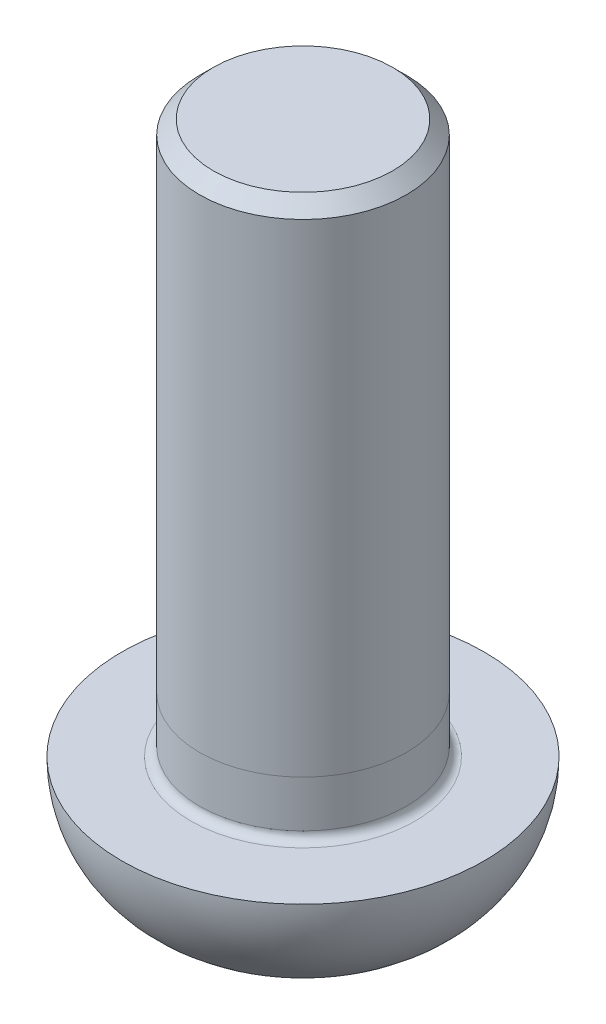
ISO-10303-21;
HEADER;
FILE_DESCRIPTION(('STEP AP214'),'2;1');
FILE_NAME('part.step','',(''),(''),'','','');
FILE_SCHEMA(('AUTOMOTIVE_DESIGN { 1 0 10303 214 1 1 1 1 }'));
ENDSEC;
DATA;
#1=APPLICATION_CONTEXT('core data for automotive mechanical design processes');
#2=APPLICATION_PROTOCOL_DEFINITION('international standard','automotive_design',2000,#1);
#3=PRODUCT_CONTEXT('',#1,'mechanical');
#4=PRODUCT('Part','Part','',(#3));
#5=PRODUCT_RELATED_PRODUCT_CATEGORY('part','',(#4));
#6=PRODUCT_DEFINITION_FORMATION('','',#4);
#7=PRODUCT_DEFINITION_CONTEXT('part definition',#1,'design');
#8=PRODUCT_DEFINITION('design','',#6,#7);
#9=PRODUCT_DEFINITION_SHAPE('','',#8);
#10=(LENGTH_UNIT() NAMED_UNIT(*) SI_UNIT(.MILLI.,.METRE.));
#11=(NAMED_UNIT(*) PLANE_ANGLE_UNIT() SI_UNIT($,.RADIAN.));
#12=(NAMED_UNIT(*) SI_UNIT($,.STERADIAN.) SOLID_ANGLE_UNIT());
#13=UNCERTAINTY_MEASURE_WITH_UNIT(LENGTH_MEASURE(1.E-05),#10,'distance_accuracy_value','');
#14=(GEOMETRIC_REPRESENTATION_CONTEXT(3) GLOBAL_UNCERTAINTY_ASSIGNED_CONTEXT((#13)) GLOBAL_UNIT_ASSIGNED_CONTEXT((#10,
#11,#12)) REPRESENTATION_CONTEXT('',''));
#15=CARTESIAN_POINT('',(0.,0.,0.));
#16=DIRECTION('',(0.,0.,1.));
#17=DIRECTION('',(1.,0.,0.));
#18=AXIS2_PLACEMENT_3D('',#15,#16,#17);
#19=CARTESIAN_POINT('',(0.,0.,0.));
#20=DIRECTION('',(0.,1.,0.));
#21=DIRECTION('',(0.,0.,1.));
#22=AXIS2_PLACEMENT_3D('',#19,#20,#21);
#23=CYLINDRICAL_SURFACE('',#22,3.);
#24=CARTESIAN_POINT('',(0.,15.6,0.));
#25=DIRECTION('',(0.,1.,0.));
#26=DIRECTION('',(0.,0.,1.));
#27=AXIS2_PLACEMENT_3D('',#24,#25,#26);
#28=CIRCLE('',#27,3.);
#29=CARTESIAN_POINT('',(0.,15.6,3.));
#30=VERTEX_POINT('',#29);
#31=EDGE_CURVE('E28',#30,#30,#28,.F.);
#32=ORIENTED_EDGE('',*,*,#31,.T.);
#33=EDGE_LOOP('',(#32));
#34=FACE_BOUND('',#33,.T.);
#35=CARTESIAN_POINT('',(0.,1.6,0.));
#36=DIRECTION('',(0.,1.,0.));
#37=DIRECTION('',(0.,0.,1.));
#38=AXIS2_PLACEMENT_3D('',#35,#36,#37);
#39=CIRCLE('',#38,3.);
#40=CARTESIAN_POINT('',(0.,1.6,3.));
#41=VERTEX_POINT('',#40);
#42=EDGE_CURVE('E11',#41,#41,#39,.T.);
#43=ORIENTED_EDGE('',*,*,#42,.T.);
#44=EDGE_LOOP('',(#43));
#45=FACE_BOUND('',#44,.T.);
#46=ADVANCED_FACE('F18',(#34,#45),#23,.T.);
#47=ORIENTED_EDGE('',*,*,#42,.F.);
#48=EDGE_LOOP('',(#47));
#49=FACE_BOUND('',#48,.T.);
#50=CARTESIAN_POINT('',(0.,0.25,0.));
#51=DIRECTION('',(0.,1.,0.));
#52=DIRECTION('',(0.,0.,1.));
#53=AXIS2_PLACEMENT_3D('',#50,#51,#52);
#54=CIRCLE('',#53,3.);
#55=CARTESIAN_POINT('',(0.,0.25,3.));
#56=VERTEX_POINT('',#55);
#57=EDGE_CURVE('E280',#56,#56,#54,.T.);
#58=ORIENTED_EDGE('',*,*,#57,.T.);
#59=EDGE_LOOP('',(#58));
#60=FACE_BOUND('',#59,.T.);
#61=ADVANCED_FACE('F192',(#49,#60),#23,.T.);
#62=CARTESIAN_POINT('',(5.25,0.,0.));
#63=DIRECTION('',(0.,1.,0.));
#64=DIRECTION('',(0.,0.,1.));
#65=AXIS2_PLACEMENT_3D('',#62,#63,#64);
#66=PLANE('',#65);
#67=CARTESIAN_POINT('',(0.,0.,0.));
#68=DIRECTION('',(0.,1.,0.));
#69=DIRECTION('',(0.,0.,1.));
#70=AXIS2_PLACEMENT_3D('',#67,#68,#69);
#71=CIRCLE('',#70,3.25);
#72=CARTESIAN_POINT('',(0.,0.,3.25));
#73=VERTEX_POINT('',#72);
#74=EDGE_CURVE('E277',#73,#73,#71,.F.);
#75=ORIENTED_EDGE('',*,*,#74,.T.);
#76=EDGE_LOOP('',(#75));
#77=FACE_BOUND('',#76,.T.);
#78=CARTESIAN_POINT('',(0.,0.,0.));
#79=DIRECTION('',(0.,1.,0.));
#80=DIRECTION('',(0.,0.,1.));
#81=AXIS2_PLACEMENT_3D('',#78,#79,#80);
#82=CIRCLE('',#81,5.25);
#83=CARTESIAN_POINT('',(0.,0.,5.25));
#84=VERTEX_POINT('',#83);
#85=EDGE_CURVE('E108',#84,#84,#82,.T.);
#86=ORIENTED_EDGE('',*,*,#85,.T.);
#87=EDGE_LOOP('',(#86));
#88=FACE_BOUND('',#87,.T.);
#89=ADVANCED_FACE('F199',(#77,#88),#66,.T.);
#90=CARTESIAN_POINT('',(0.,16.,0.));
#91=DIRECTION('',(0.,1.,0.));
#92=DIRECTION('',(0.,0.,1.));
#93=AXIS2_PLACEMENT_3D('',#90,#91,#92);
#94=PLANE('',#93);
#95=CARTESIAN_POINT('',(0.,16.,0.));
#96=DIRECTION('',(0.,1.,0.));
#97=DIRECTION('',(0.,0.,1.));
#98=AXIS2_PLACEMENT_3D('',#95,#96,#97);
#99=CIRCLE('',#98,2.6);
#100=CARTESIAN_POINT('',(0.,16.,2.6));
#101=VERTEX_POINT('',#100);
#102=EDGE_CURVE('E282',#101,#101,#99,.T.);
#103=ORIENTED_EDGE('',*,*,#102,.T.);
#104=EDGE_LOOP('',(#103));
#105=FACE_BOUND('',#104,.T.);
#106=ADVANCED_FACE('F227',(#105),#94,.T.);
#107=CARTESIAN_POINT('',(0.,0.25,0.));
#108=DIRECTION('',(0.,1.,0.));
#109=DIRECTION('',(0.,0.,1.));
#110=AXIS2_PLACEMENT_3D('',#107,#108,#109);
#111=TOROIDAL_SURFACE('',#110,3.25,0.25);
#112=ORIENTED_EDGE('',*,*,#74,.F.);
#113=EDGE_LOOP('',(#112));
#114=FACE_BOUND('',#113,.T.);
#115=ORIENTED_EDGE('',*,*,#57,.F.);
#116=EDGE_LOOP('',(#115));
#117=FACE_BOUND('',#116,.T.);
#118=ADVANCED_FACE('F265',(#114,#117),#111,.F.);
#119=CARTESIAN_POINT('',(0.,16.,0.));
#120=DIRECTION('',(0.,-1.,0.));
#121=DIRECTION('',(0.,0.,-1.));
#122=AXIS2_PLACEMENT_3D('',#119,#120,#121);
#123=CONICAL_SURFACE('',#122,2.6,0.785398163397449);
#124=ORIENTED_EDGE('',*,*,#31,.F.);
#125=EDGE_LOOP('',(#124));
#126=FACE_BOUND('',#125,.T.);
#127=ORIENTED_EDGE('',*,*,#102,.F.);
#128=EDGE_LOOP('',(#127));
#129=FACE_BOUND('',#128,.T.);
#130=ADVANCED_FACE('F21',(#126,#129),#123,.T.);
#131=CARTESIAN_POINT('',(0.,0.,0.));
#132=DIRECTION('',(0.,-1.,0.));
#133=DIRECTION('',(0.,0.,-1.));
#134=AXIS2_PLACEMENT_3D('',#131,#132,#133);
#135=DEGENERATE_TOROIDAL_SURFACE('',#134,1.67165208586472,3.57834791413527,.T.);
#136=ORIENTED_EDGE('',*,*,#85,.F.);
#137=EDGE_LOOP('',(#136));
#138=FACE_BOUND('',#137,.T.);
#139=CARTESIAN_POINT('',(0.,-3.3,0.));
#140=DIRECTION('',(0.,-1.,0.));
#141=DIRECTION('',(0.,0.,-1.));
#142=AXIS2_PLACEMENT_3D('',#139,#140,#141);
#143=CIRCLE('',#142,3.05533333333333);
#144=CARTESIAN_POINT('',(0.,-3.3,-3.05533333333333));
#145=VERTEX_POINT('',#144);
#146=EDGE_CURVE('E119',#145,#145,#143,.T.);
#147=ORIENTED_EDGE('',*,*,#146,.F.);
#148=EDGE_LOOP('',(#147));
#149=FACE_BOUND('',#148,.T.);
#150=ADVANCED_FACE('F143',(#138,#149),#135,.T.);
#151=CARTESIAN_POINT('',(0.,0.391673276442843,0.));
#152=DIRECTION('',(0.,-1.,0.));
#153=DIRECTION('',(0.,0.,-1.));
#154=AXIS2_PLACEMENT_3D('',#151,#152,#153);
#155=CONICAL_SURFACE('',#154,0.,1.0471975511966);
#156=CARTESIAN_POINT('',(0.,0.391673276442843,0.));
#157=VERTEX_POINT('',#156);
#158=VERTEX_LOOP('',#157);
#159=FACE_BOUND('',#158,.T.);
#160=CARTESIAN_POINT('',(-1.15458506832542,-0.94172672855691,2.0002));
#161=CARTESIAN_POINT('',(-1.20532911262018,-0.91241679803709,1.91230873709994));
#162=CARTESIAN_POINT('',(-1.2565111744778,-0.885760113916877,1.82365880552641));
#163=CARTESIAN_POINT('',(-1.3597616401932,-0.839229752957131,1.6448237530022));
#164=CARTESIAN_POINT('',(-1.41183187919145,-0.81937253831919,1.55463545349496));
#165=CARTESIAN_POINT('',(-1.51532701829184,-0.788460725959663,1.37537661423669));
#166=CARTESIAN_POINT('',(-1.56673599086579,-0.777200413534941,1.28633366177369));
#167=CARTESIAN_POINT('',(-1.66979593505374,-0.763755924531052,1.10782860221495));
#168=CARTESIAN_POINT('',(-1.72144653186531,-0.76156061688988,1.01836714429604));
#169=CARTESIAN_POINT('',(-1.81796535054794,-0.766118251267061,0.851191646451196));
#170=CARTESIAN_POINT('',(-1.86284799277603,-0.771752136623426,0.773452629734213));
#171=CARTESIAN_POINT('',(-1.95232085557725,-0.789611157197239,0.618481085463865));
#172=CARTESIAN_POINT('',(-1.99691076648955,-0.80184239795985,0.5412490942588));
#173=CARTESIAN_POINT('',(-2.08656822922817,-0.83242069880402,0.385957813517798));
#174=CARTESIAN_POINT('',(-2.13162442866767,-0.850897429002127,0.30791818689262));
#175=CARTESIAN_POINT('',(-2.221064675979,-0.892832780149267,0.153003134307866));
#176=CARTESIAN_POINT('',(-2.26544987045196,-0.916281542428724,0.0761257223768805));
#177=CARTESIAN_POINT('',(-2.30951654681234,-0.941726728556909,-0.000200000000000286));
#178=B_SPLINE_CURVE_WITH_KNOTS('',3,(#160,#161,#162,#163,#164,#165,#166,#167,#168,#169,#170,
#171,#172,#173,#174,#175,#176,#177),.UNSPECIFIED.,.F.,.F.,(4,2,2,2,2,2,2,2,4),(0.,
0.317031824695611,0.634825876346566,0.944753967652639,1.25430138000372,1.52387047293094,
1.79368946861028,2.06949491027634,2.34475850821472),.UNSPECIFIED.);
#179=CARTESIAN_POINT('',(-1.15470053837926,-0.941660056890495,2.));
#180=VERTEX_POINT('',#179);
#181=CARTESIAN_POINT('',(-2.3094010767585,-0.941660056890495,0.));
#182=VERTEX_POINT('',#181);
#183=EDGE_CURVE('E231',#180,#182,#178,.T.);
#184=ORIENTED_EDGE('',*,*,#183,.T.);
#185=CARTESIAN_POINT('',(-2.30951654681234,-0.941726728556909,0.000200000000000068));
#186=CARTESIAN_POINT('',(-2.25877250251757,-0.912416798037087,-0.0876912629000592));
#187=CARTESIAN_POINT('',(-2.20759044065995,-0.885760113916874,-0.17634119447359));
#188=CARTESIAN_POINT('',(-2.10433997494456,-0.839229752957128,-0.355176246997801));
#189=CARTESIAN_POINT('',(-2.0522697359463,-0.819372538319187,-0.445364546505036));
#190=CARTESIAN_POINT('',(-1.94877459684592,-0.78846072595966,-0.624623385763305));
#191=CARTESIAN_POINT('',(-1.89736562427197,-0.777200413534938,-0.713666338226303));
#192=CARTESIAN_POINT('',(-1.79430568008402,-0.76375592453105,-0.892171397785043));
#193=CARTESIAN_POINT('',(-1.74265508327244,-0.761560616889878,-0.981632855703958));
#194=CARTESIAN_POINT('',(-1.64613626458981,-0.766118251267059,-1.1488083535488));
#195=CARTESIAN_POINT('',(-1.60125362236172,-0.771752136623423,-1.22654737026578));
#196=CARTESIAN_POINT('',(-1.5117807595605,-0.789611157197236,-1.38151891453613));
#197=CARTESIAN_POINT('',(-1.46719084864821,-0.801842397959847,-1.4587509057412));
#198=CARTESIAN_POINT('',(-1.37753338590959,-0.832420698804018,-1.6140421864822));
#199=CARTESIAN_POINT('',(-1.33247718647008,-0.850897429002124,-1.69208181310738));
#200=CARTESIAN_POINT('',(-1.24303693915875,-0.892832780149265,-1.84699686569214));
#201=CARTESIAN_POINT('',(-1.19865174468579,-0.916281542428723,-1.92387427762312));
#202=CARTESIAN_POINT('',(-1.15458506832541,-0.94172672855691,-2.0002));
#203=B_SPLINE_CURVE_WITH_KNOTS('',3,(#185,#186,#187,#188,#189,#190,#191,#192,#193,#194,#195,
#196,#197,#198,#199,#200,#201,#202),.UNSPECIFIED.,.F.,.F.,(4,2,2,2,2,2,2,2,4),(0.,
0.317031824695611,0.634825876346565,0.944753967652637,1.25430138000371,1.52387047293094,
1.79368946861029,2.06949491027634,2.34475850821473),.UNSPECIFIED.);
#204=CARTESIAN_POINT('',(-1.15470053837925,-0.941660056890493,-2.));
#205=VERTEX_POINT('',#204);
#206=EDGE_CURVE('E210',#182,#205,#203,.T.);
#207=ORIENTED_EDGE('',*,*,#206,.T.);
#208=CARTESIAN_POINT('',(-3.97107242292986,-2.17538835040825,-2.));
#209=CARTESIAN_POINT('',(-3.87868247277526,-2.12775059746127,-2.));
#210=CARTESIAN_POINT('',(-3.7861588003778,-2.08037372958414,-2.));
#211=CARTESIAN_POINT('',(-3.60078450821548,-1.98626017948102,-2.00000000000001));
#212=CARTESIAN_POINT('',(-3.50793388259158,-1.93952350880157,-2.00000000000001));
#213=CARTESIAN_POINT('',(-3.22850900761148,-1.80030535880982,-2.));
#214=CARTESIAN_POINT('',(-3.04135761037277,-1.70896924768975,-2.));
#215=CARTESIAN_POINT('',(-2.75397555619272,-1.5731154540905,-2.));
#216=CARTESIAN_POINT('',(-2.65454530475032,-1.52690595800733,-2.));
#217=CARTESIAN_POINT('',(-2.45492785759602,-1.43615536855376,-2.));
#218=CARTESIAN_POINT('',(-2.3547406899451,-1.39161421369455,-2.));
#219=CARTESIAN_POINT('',(-2.15350213975009,-1.30470652650298,-2.));
#220=CARTESIAN_POINT('',(-2.05245137959688,-1.26233856057289,-2.));
#221=CARTESIAN_POINT('',(-1.84919030086332,-1.18039650371769,-2.));
#222=CARTESIAN_POINT('',(-1.74697972173689,-1.14082305558609,-2.));
#223=CARTESIAN_POINT('',(-1.52508206994959,-1.05946514421621,-2.));
#224=CARTESIAN_POINT('',(-1.40516322629618,-1.01830385306277,-2.));
#225=CARTESIAN_POINT('',(-1.16321218809007,-0.942832074454553,-2.));
#226=CARTESIAN_POINT('',(-1.04118108489843,-0.908518157540933,-2.));
#227=CARTESIAN_POINT('',(-0.797191699347654,-0.849762632395411,-2.));
#228=CARTESIAN_POINT('',(-0.675277439673617,-0.825143320410585,-2.));
#229=CARTESIAN_POINT('',(-0.42968597996561,-0.78740551194056,-2.));
#230=CARTESIAN_POINT('',(-0.306009864773069,-0.774280224898857,-2.));
#231=CARTESIAN_POINT('',(-0.0561948130021474,-0.761222818220792,-2.));
#232=CARTESIAN_POINT('',(0.0699543957642671,-0.761477523372083,-2.));
#233=CARTESIAN_POINT('',(0.321490472578919,-0.775609005131668,-2.));
#234=CARTESIAN_POINT('',(0.446877078128915,-0.789490231676833,-2.));
#235=CARTESIAN_POINT('',(0.698268076239721,-0.829339251040338,-2.));
#236=CARTESIAN_POINT('',(0.824232704616094,-0.855548309192251,-1.99999999999999));
#237=CARTESIAN_POINT('',(1.07382197335698,-0.917314019236256,-2.));
#238=CARTESIAN_POINT('',(1.19744582529425,-0.952873762658447,-2.));
#239=CARTESIAN_POINT('',(1.43877717975325,-1.02962266424125,-2.));
#240=CARTESIAN_POINT('',(1.55655051066925,-1.07060890554915,-2.));
#241=CARTESIAN_POINT('',(1.79038315988528,-1.15724391469459,-1.99999999999999));
#242=CARTESIAN_POINT('',(1.90644203337208,-1.20289386902531,-1.99999999999999));
#243=CARTESIAN_POINT('',(2.13727613898438,-1.29764227315016,-1.99999999999999));
#244=CARTESIAN_POINT('',(2.25204987258198,-1.3467443434052,-1.99999999999999));
#245=CARTESIAN_POINT('',(2.48048565996255,-1.44747310577301,-1.99999999999999));
#246=CARTESIAN_POINT('',(2.59414765093807,-1.499099939544,-1.99999999999999));
#247=CARTESIAN_POINT('',(2.81406706680889,-1.60122748447267,-1.99999999999999));
#248=CARTESIAN_POINT('',(2.92037405177845,-1.65162191070667,-1.99999999999999));
#249=CARTESIAN_POINT('',(3.1323563665145,-1.75372845058398,-1.99999999999999));
#250=CARTESIAN_POINT('',(3.23803167473215,-1.80544060886685,-1.99999999999999));
#251=CARTESIAN_POINT('',(3.44851064882037,-1.90972549113419,-1.99999999999999));
#252=CARTESIAN_POINT('',(3.55331605390046,-1.96229471304186,-1.99999999999999));
#253=CARTESIAN_POINT('',(3.7624942913087,-2.06826501338616,-1.99999999999999));
#254=CARTESIAN_POINT('',(3.86686716058578,-2.12166601883339,-1.99999999999999));
#255=CARTESIAN_POINT('',(3.97107242292986,-2.17538835040825,-2.));
#256=B_SPLINE_CURVE_WITH_KNOTS('',3,(#208,#209,#210,#211,#212,#213,#214,#215,#216,#217,#218,
#219,#220,#221,#222,#223,#224,#225,#226,#227,#228,#229,#230,#231,#232,#233,#234,#235,#236,#237,
#238,#239,#240,#241,#242,#243,#244,#245,#246,#247,#248,#249,#250,#251,#252,#253,#254,#255),
.UNSPECIFIED.,.F.,.F.,(4,2,2,2,2,2,2,2,2,2,2,2,2,2,2,2,2,2,2,2,2,2,2,4),(0.,0.311842723826934,
0.62369106463389,1.24838758455579,1.57730682351192,1.90621392778465,2.23490119378745,
2.56366381964157,2.94387628317646,3.32389783939494,3.69658721194995,4.06905625447051,
4.44672744508521,4.82452201071132,5.21003920255201,5.59568401496473,5.96965872681082,
6.34372881945369,6.71819725104189,7.09268671728378,7.44561614609446,7.79855754669429,
8.15030525169476,8.50202226264185),.UNSPECIFIED.);
#257=CARTESIAN_POINT('',(1.15470053837925,-0.941660056890495,-2.));
#258=VERTEX_POINT('',#257);
#259=EDGE_CURVE('E106',#205,#258,#256,.T.);
#260=ORIENTED_EDGE('',*,*,#259,.T.);
#261=CARTESIAN_POINT('',(1.15458506832542,-0.941726728556909,-2.0002));
#262=CARTESIAN_POINT('',(1.20532911262018,-0.912416798037089,-1.91230873709994));
#263=CARTESIAN_POINT('',(1.2565111744778,-0.885760113916877,-1.82365880552641));
#264=CARTESIAN_POINT('',(1.3597616401932,-0.839229752957131,-1.6448237530022));
#265=CARTESIAN_POINT('',(1.41183187919145,-0.819372538319189,-1.55463545349496));
#266=CARTESIAN_POINT('',(1.51532701829183,-0.788460725959662,-1.37537661423669));
#267=CARTESIAN_POINT('',(1.56673599086579,-0.77720041353494,-1.2863336617737));
#268=CARTESIAN_POINT('',(1.66979593505373,-0.763755924531052,-1.10782860221496));
#269=CARTESIAN_POINT('',(1.72144653186531,-0.761560616889879,-1.01836714429604));
#270=CARTESIAN_POINT('',(1.81796535054794,-0.76611825126706,-0.851191646451199));
#271=CARTESIAN_POINT('',(1.86284799277603,-0.771752136623425,-0.773452629734215));
#272=CARTESIAN_POINT('',(1.95232085557725,-0.789611157197238,-0.618481085463866));
#273=CARTESIAN_POINT('',(1.99691076648955,-0.801842397959849,-0.5412490942588));
#274=CARTESIAN_POINT('',(2.08656822922816,-0.83242069880402,-0.385957813517798));
#275=CARTESIAN_POINT('',(2.13162442866767,-0.850897429002126,-0.307918186892619));
#276=CARTESIAN_POINT('',(2.221064675979,-0.892832780149266,-0.153003134307863));
#277=CARTESIAN_POINT('',(2.26544987045196,-0.916281542428724,-0.0761257223768775));
#278=CARTESIAN_POINT('',(2.30951654681234,-0.941726728556909,0.000200000000003712));
#279=B_SPLINE_CURVE_WITH_KNOTS('',3,(#261,#262,#263,#264,#265,#266,#267,#268,#269,#270,#271,
#272,#273,#274,#275,#276,#277,#278),.UNSPECIFIED.,.F.,.F.,(4,2,2,2,2,2,2,2,4),(0.,
0.31703182469561,0.634825876346564,0.944753967652636,1.25430138000371,1.52387047293094,
1.79368946861028,2.06949491027634,2.34475850821473),.UNSPECIFIED.);
#280=CARTESIAN_POINT('',(2.3094010767585,-0.941660056890495,0.));
#281=VERTEX_POINT('',#280);
#282=EDGE_CURVE('E255',#258,#281,#279,.T.);
#283=ORIENTED_EDGE('',*,*,#282,.T.);
#284=CARTESIAN_POINT('',(2.30951654681234,-0.941726728556909,-0.000199999999996057));
#285=CARTESIAN_POINT('',(2.25877250251757,-0.912416798037088,0.0876912629000633));
#286=CARTESIAN_POINT('',(2.20759044065995,-0.885760113916875,0.176341194473594));
#287=CARTESIAN_POINT('',(2.10433997494456,-0.839229752957129,0.355176246997805));
#288=CARTESIAN_POINT('',(2.0522697359463,-0.819372538319187,0.445364546505039));
#289=CARTESIAN_POINT('',(1.94877459684592,-0.78846072595966,0.624623385763309));
#290=CARTESIAN_POINT('',(1.89736562427197,-0.777200413534938,0.713666338226308));
#291=CARTESIAN_POINT('',(1.79430568008402,-0.76375592453105,0.892171397785046));
#292=CARTESIAN_POINT('',(1.74265508327243,-0.761560616889878,0.98163285570396));
#293=CARTESIAN_POINT('',(1.64613626458981,-0.766118251267059,1.1488083535488));
#294=CARTESIAN_POINT('',(1.60125362236172,-0.771752136623423,1.22654737026579));
#295=CARTESIAN_POINT('',(1.5117807595605,-0.789611157197236,1.38151891453614));
#296=CARTESIAN_POINT('',(1.46719084864821,-0.801842397959848,1.4587509057412));
#297=CARTESIAN_POINT('',(1.37753338590959,-0.832420698804018,1.6140421864822));
#298=CARTESIAN_POINT('',(1.33247718647008,-0.850897429002125,1.69208181310738));
#299=CARTESIAN_POINT('',(1.24303693915875,-0.892832780149265,1.84699686569214));
#300=CARTESIAN_POINT('',(1.19865174468579,-0.916281542428723,1.92387427762312));
#301=CARTESIAN_POINT('',(1.15458506832541,-0.941726728556909,2.0002));
#302=B_SPLINE_CURVE_WITH_KNOTS('',3,(#284,#285,#286,#287,#288,#289,#290,#291,#292,#293,#294,
#295,#296,#297,#298,#299,#300,#301),.UNSPECIFIED.,.F.,.F.,(4,2,2,2,2,2,2,2,4),(0.,
0.317031824695611,0.634825876346565,0.944753967652638,1.25430138000371,1.52387047293094,
1.79368946861028,2.06949491027634,2.34475850821473),.UNSPECIFIED.);
#303=CARTESIAN_POINT('',(1.15470053837924,-0.941660056890494,2.));
#304=VERTEX_POINT('',#303);
#305=EDGE_CURVE('E249',#281,#304,#302,.T.);
#306=ORIENTED_EDGE('',*,*,#305,.T.);
#307=CARTESIAN_POINT('',(3.97107242292986,-2.17538835040825,2.));
#308=CARTESIAN_POINT('',(3.87868247277525,-2.12775059746126,2.));
#309=CARTESIAN_POINT('',(3.7861588003778,-2.08037372958414,2.00000000000001));
#310=CARTESIAN_POINT('',(3.60078450821547,-1.98626017948102,2.00000000000001));
#311=CARTESIAN_POINT('',(3.50793388259158,-1.93952350880157,2.00000000000001));
#312=CARTESIAN_POINT('',(3.22850900761148,-1.80030535880982,2.));
#313=CARTESIAN_POINT('',(3.04135761037276,-1.70896924768974,2.));
#314=CARTESIAN_POINT('',(2.75397555619272,-1.5731154540905,2.));
#315=CARTESIAN_POINT('',(2.65454530475031,-1.52690595800733,2.));
#316=CARTESIAN_POINT('',(2.45492785759602,-1.43615536855376,2.));
#317=CARTESIAN_POINT('',(2.35474068994509,-1.39161421369454,2.));
#318=CARTESIAN_POINT('',(2.15350213975008,-1.30470652650297,2.));
#319=CARTESIAN_POINT('',(2.05245137959687,-1.26233856057289,2.));
#320=CARTESIAN_POINT('',(1.84919030086332,-1.18039650371768,2.));
#321=CARTESIAN_POINT('',(1.74697972173688,-1.14082305558609,2.));
#322=CARTESIAN_POINT('',(1.52508206994959,-1.05946514421621,2.));
#323=CARTESIAN_POINT('',(1.40516322629617,-1.01830385306277,2.));
#324=CARTESIAN_POINT('',(1.16321218809006,-0.942832074454551,2.));
#325=CARTESIAN_POINT('',(1.04118108489842,-0.90851815754093,2.));
#326=CARTESIAN_POINT('',(0.797191699347647,-0.849762632395409,2.));
#327=CARTESIAN_POINT('',(0.675277439673609,-0.825143320410583,2.));
#328=CARTESIAN_POINT('',(0.429685979965601,-0.787405511940558,2.));
#329=CARTESIAN_POINT('',(0.30600986477306,-0.774280224898856,2.));
#330=CARTESIAN_POINT('',(0.0561948130021376,-0.761222818220792,2.));
#331=CARTESIAN_POINT('',(-0.0699543957642771,-0.761477523372083,2.));
#332=CARTESIAN_POINT('',(-0.32149047257893,-0.775609005131668,2.));
#333=CARTESIAN_POINT('',(-0.446877078128926,-0.789490231676834,2.));
#334=CARTESIAN_POINT('',(-0.698268076239732,-0.82933925104034,2.));
#335=CARTESIAN_POINT('',(-0.824232704616105,-0.855548309192252,1.99999999999999));
#336=CARTESIAN_POINT('',(-1.07382197335699,-0.917314019236258,2.));
#337=CARTESIAN_POINT('',(-1.19744582529427,-0.95287376265845,2.));
#338=CARTESIAN_POINT('',(-1.43877717975326,-1.02962266424125,2.));
#339=CARTESIAN_POINT('',(-1.55655051066926,-1.07060890554915,1.99999999999999));
#340=CARTESIAN_POINT('',(-1.79038315988529,-1.15724391469459,1.99999999999999));
#341=CARTESIAN_POINT('',(-1.90644203337209,-1.20289386902531,1.99999999999999));
#342=CARTESIAN_POINT('',(-2.13727613898438,-1.29764227315017,1.99999999999999));
#343=CARTESIAN_POINT('',(-2.25204987258199,-1.3467443434052,1.99999999999999));
#344=CARTESIAN_POINT('',(-2.48048565996256,-1.44747310577301,1.99999999999999));
#345=CARTESIAN_POINT('',(-2.59414765093807,-1.499099939544,1.99999999999999));
#346=CARTESIAN_POINT('',(-2.81406706680889,-1.60122748447267,1.99999999999999));
#347=CARTESIAN_POINT('',(-2.92037405177846,-1.65162191070667,1.99999999999999));
#348=CARTESIAN_POINT('',(-3.1323563665145,-1.75372845058398,1.99999999999999));
#349=CARTESIAN_POINT('',(-3.23803167473215,-1.80544060886684,1.99999999999999));
#350=CARTESIAN_POINT('',(-3.44851064882038,-1.90972549113419,1.99999999999999));
#351=CARTESIAN_POINT('',(-3.55331605390046,-1.96229471304186,1.99999999999999));
#352=CARTESIAN_POINT('',(-3.7624942913087,-2.06826501338616,1.99999999999999));
#353=CARTESIAN_POINT('',(-3.86686716058578,-2.12166601883338,1.99999999999999));
#354=CARTESIAN_POINT('',(-3.97107242292986,-2.17538835040825,2.));
#355=B_SPLINE_CURVE_WITH_KNOTS('',3,(#307,#308,#309,#310,#311,#312,#313,#314,#315,#316,#317,
#318,#319,#320,#321,#322,#323,#324,#325,#326,#327,#328,#329,#330,#331,#332,#333,#334,#335,#336,
#337,#338,#339,#340,#341,#342,#343,#344,#345,#346,#347,#348,#349,#350,#351,#352,#353,#354),
.UNSPECIFIED.,.F.,.F.,(4,2,2,2,2,2,2,2,2,2,2,2,2,2,2,2,2,2,2,2,2,2,2,4),(0.,0.311842723826934,
0.623691064633889,1.24838758455579,1.57730682351192,1.90621392778465,2.23490119378744,
2.56366381964157,2.94387628317646,3.32389783939494,3.69658721194995,4.06905625447051,
4.44672744508521,4.82452201071133,5.21003920255201,5.59568401496474,5.96965872681082,
6.34372881945369,6.71819725104189,7.09268671728378,7.44561614609446,7.79855754669429,
8.15030525169475,8.50202226264184),.UNSPECIFIED.);
#356=EDGE_CURVE('E241',#304,#180,#355,.T.);
#357=ORIENTED_EDGE('',*,*,#356,.T.);
#358=EDGE_LOOP('',(#184,#207,#260,#283,#306,#357));
#359=FACE_BOUND('',#358,.T.);
#360=ADVANCED_FACE('F176',(#159,#359),#155,.F.);
#361=CARTESIAN_POINT('',(-1.15470053837925,21.0513859975157,-2.));
#362=DIRECTION('',(0.,0.,-1.));
#363=DIRECTION('',(-1.,0.,0.));
#364=AXIS2_PLACEMENT_3D('',#361,#362,#363);
#365=PLANE('',#364);
#366=CARTESIAN_POINT('',(3.54576846416073,-3.77200034906826,-2.));
#367=CARTESIAN_POINT('',(3.46032331155691,-3.75206057830071,-1.99999999999999));
#368=CARTESIAN_POINT('',(3.37484047761441,-3.73228232054218,-1.99999999999999));
#369=CARTESIAN_POINT('',(3.20378355240315,-3.69311847013324,-1.99999999999999));
#370=CARTESIAN_POINT('',(3.11820945972395,-3.67373288364707,-1.99999999999999));
#371=CARTESIAN_POINT('',(2.86130062428642,-3.61626384835692,-1.99999999999999));
#372=CARTESIAN_POINT('',(2.68980910024909,-3.57887512354549,-1.99999999999999));
#373=CARTESIAN_POINT('',(2.34458511529228,-3.50643853365192,-1.99999999999999));
#374=CARTESIAN_POINT('',(2.1708470844132,-3.47141698135254,-1.99999999999999));
#375=CARTESIAN_POINT('',(1.82256095831907,-3.40547978469486,-1.99999999999999));
#376=CARTESIAN_POINT('',(1.64801278540453,-3.37456454295519,-1.99999999999999));
#377=CARTESIAN_POINT('',(1.30271990845847,-3.31969790886641,-1.99999999999999));
#378=CARTESIAN_POINT('',(1.13200256296387,-3.29557843402185,-2.));
#379=CARTESIAN_POINT('',(0.789571689000483,-3.25587323584062,-2.));
#380=CARTESIAN_POINT('',(0.617858499834699,-3.24028476073478,-2.));
#381=CARTESIAN_POINT('',(0.36019540394543,-3.22525401912313,-2.));
#382=CARTESIAN_POINT('',(0.274483715684513,-3.22163460627376,-2.));
#383=CARTESIAN_POINT('',(0.102984480205781,-3.21731952917178,-2.));
#384=CARTESIAN_POINT('',(0.0171969334570649,-3.21662384696397,-2.));
#385=CARTESIAN_POINT('',(-0.15435587366281,-3.21819853237707,-2.));
#386=CARTESIAN_POINT('',(-0.240121132206929,-3.22046909420923,-2.));
#387=CARTESIAN_POINT('',(-0.411526390365097,-3.22785312413437,-2.));
#388=CARTESIAN_POINT('',(-0.497166389972947,-3.23296659236802,-2.));
#389=CARTESIAN_POINT('',(-0.706478859815856,-3.24865578967162,-2.));
#390=CARTESIAN_POINT('',(-0.830044925850673,-3.26065132303124,-2.));
#391=CARTESIAN_POINT('',(-1.07664653209346,-3.28907898341361,-2.));
#392=CARTESIAN_POINT('',(-1.19968208520209,-3.30551100192753,-2.));
#393=CARTESIAN_POINT('',(-1.44564714901042,-3.34186148211041,-2.));
#394=CARTESIAN_POINT('',(-1.5685749476794,-3.36179135163048,-2.));
#395=CARTESIAN_POINT('',(-1.81398159923811,-3.40425123821713,-2.));
#396=CARTESIAN_POINT('',(-1.93646042849967,-3.42678139015956,-2.));
#397=CARTESIAN_POINT('',(-2.18362417007064,-3.47428425653496,-2.));
#398=CARTESIAN_POINT('',(-2.30830103623406,-3.49929851142906,-2.));
#399=CARTESIAN_POINT('',(-2.55733999903382,-3.55084664791934,-2.));
#400=CARTESIAN_POINT('',(-2.68170209177125,-3.57738054824321,-2.));
#401=CARTESIAN_POINT('',(-2.92946437432296,-3.6314395789905,-2.));
#402=CARTESIAN_POINT('',(-3.05286599737638,-3.65895817166457,-2.));
#403=CARTESIAN_POINT('',(-3.29945995688185,-3.71487849715073,-2.));
#404=CARTESIAN_POINT('',(-3.4226523077504,-3.74328016629155,-2.));
#405=CARTESIAN_POINT('',(-3.54576846416072,-3.77200034906825,-2.));
#406=B_SPLINE_CURVE_WITH_KNOTS('',3,(#366,#367,#368,#369,#370,#371,#372,#373,#374,#375,#376,
#377,#378,#379,#380,#381,#382,#383,#384,#385,#386,#387,#388,#389,#390,#391,#392,#393,#394,#395,
#396,#397,#398,#399,#400,#401,#402,#403,#404,#405),.UNSPECIFIED.,.F.,.F.,(4,2,2,2,2,2,2,2,2,2,2,
2,2,2,2,2,2,2,2,4),(0.,0.263222401305707,0.526448931537518,1.05299375162049,1.58466125538442,
2.11638085006353,2.63348257137836,3.15041739730246,3.40773776741521,3.66505655727231,
3.92239219561216,4.17972784668616,4.55206097335711,4.92438499422329,5.29794667206535,
5.67152773515151,6.05299963584967,6.43447623871299,6.81377086422972,7.19303820510549),.UNSPECIFIED.);
#407=CARTESIAN_POINT('',(1.15470053837925,-3.3,-2.));
#408=VERTEX_POINT('',#407);
#409=CARTESIAN_POINT('',(-1.15470053837925,-3.3,-2.));
#410=VERTEX_POINT('',#409);
#411=EDGE_CURVE('E87',#408,#410,#406,.T.);
#412=ORIENTED_EDGE('',*,*,#411,.F.);
#413=DIRECTION('',(0.,-1.,0.));
#414=VECTOR('',#413,1.);
#415=CARTESIAN_POINT('',(1.15470053837925,21.0513859975157,-2.));
#416=LINE('',#415,#414);
#417=EDGE_CURVE('E109',#258,#408,#416,.T.);
#418=ORIENTED_EDGE('',*,*,#417,.F.);
#419=ORIENTED_EDGE('',*,*,#259,.F.);
#420=DIRECTION('',(0.,-1.,0.));
#421=VECTOR('',#420,1.);
#422=CARTESIAN_POINT('',(-1.15470053837925,21.0513859975157,-2.));
#423=LINE('',#422,#421);
#424=EDGE_CURVE('E99',#205,#410,#423,.T.);
#425=ORIENTED_EDGE('',*,*,#424,.T.);
#426=EDGE_LOOP('',(#412,#418,#419,#425));
#427=FACE_BOUND('',#426,.T.);
#428=ADVANCED_FACE('F104',(#427),#365,.F.);
#429=CARTESIAN_POINT('',(1.15470053837925,21.0513859975157,-2.));
#430=DIRECTION('',(0.86602540378444,0.,-0.5));
#431=DIRECTION('',(-0.5,0.,-0.86602540378444));
#432=AXIS2_PLACEMENT_3D('',#429,#430,#431);
#433=PLANE('',#432);
#434=CARTESIAN_POINT('',(2.30951654681234,-3.30003094242808,0.000200000000003903));
#435=CARTESIAN_POINT('',(2.26155517902373,-3.28717294728116,-0.0828715258103687));
#436=CARTESIAN_POINT('',(2.21350683851658,-3.27549990930549,-0.166093692788127));
#437=CARTESIAN_POINT('',(2.11724043254796,-3.25499135519067,-0.332831998987827));
#438=CARTESIAN_POINT('',(2.06902230613691,-3.24615699216786,-0.416348243777552));
#439=CARTESIAN_POINT('',(1.972708744238,-3.231841640157,-0.58316822644438));
#440=CARTESIAN_POINT('',(1.92461396034488,-3.22634357564339,-0.666470835726323));
#441=CARTESIAN_POINT('',(1.8283630443694,-3.21897122197136,-0.8331823124709));
#442=CARTESIAN_POINT('',(1.78020692596914,-3.21709623134525,-0.91659115623545));
#443=CARTESIAN_POINT('',(1.68389468916862,-3.21709623134525,-1.08340884376455));
#444=CARTESIAN_POINT('',(1.63573857076836,-3.21897122197136,-1.1668176875291));
#445=CARTESIAN_POINT('',(1.53948765479288,-3.22634357564339,-1.33352916427367));
#446=CARTESIAN_POINT('',(1.49139287089975,-3.231841640157,-1.41683177355562));
#447=CARTESIAN_POINT('',(1.39507930900085,-3.24615699216786,-1.58365175622245));
#448=CARTESIAN_POINT('',(1.3468611825898,-3.25499135519067,-1.66716800101217));
#449=CARTESIAN_POINT('',(1.25059477662118,-3.27549990930549,-1.83390630721187));
#450=CARTESIAN_POINT('',(1.20254643611403,-3.28717294728116,-1.91712847418963));
#451=CARTESIAN_POINT('',(1.15458506832542,-3.30003094242808,-2.0002));
#452=B_SPLINE_CURVE_WITH_KNOTS('',3,(#434,#435,#436,#437,#438,#439,#440,#441,#442,#443,#444,
#445,#446,#447,#448,#449,#450,#451),.UNSPECIFIED.,.F.,.F.,(4,2,2,2,2,2,2,2,4),(0.,
0.290357249044671,0.580832297293914,0.869807841095772,1.15872743038697,1.44764701967818,
1.73662256348004,2.02709761172928,2.31745486077395),.UNSPECIFIED.);
#453=CARTESIAN_POINT('',(2.30940107675851,-3.3,0.));
#454=VERTEX_POINT('',#453);
#455=EDGE_CURVE('E94',#454,#408,#452,.T.);
#456=ORIENTED_EDGE('',*,*,#455,.F.);
#457=DIRECTION('',(0.,-1.,0.));
#458=VECTOR('',#457,1.);
#459=CARTESIAN_POINT('',(2.3094010767585,21.0513859975157,0.));
#460=LINE('',#459,#458);
#461=EDGE_CURVE('E313',#281,#454,#460,.T.);
#462=ORIENTED_EDGE('',*,*,#461,.F.);
#463=ORIENTED_EDGE('',*,*,#282,.F.);
#464=ORIENTED_EDGE('',*,*,#417,.T.);
#465=EDGE_LOOP('',(#456,#462,#463,#464));
#466=FACE_BOUND('',#465,.T.);
#467=ADVANCED_FACE('F175',(#466),#433,.F.);
#468=CARTESIAN_POINT('',(2.3094010767585,21.0513859975157,0.));
#469=DIRECTION('',(0.866025403784437,0.,0.5));
#470=DIRECTION('',(0.5,0.,-0.866025403784437));
#471=AXIS2_PLACEMENT_3D('',#468,#469,#470);
#472=PLANE('',#471);
#473=CARTESIAN_POINT('',(1.15458506832541,-3.30003094242808,2.0002));
#474=CARTESIAN_POINT('',(1.20254643611402,-3.28717294728116,1.91712847418963));
#475=CARTESIAN_POINT('',(1.25059477662117,-3.27549990930549,1.83390630721187));
#476=CARTESIAN_POINT('',(1.34686118258979,-3.25499135519067,1.66716800101217));
#477=CARTESIAN_POINT('',(1.39507930900085,-3.24615699216786,1.58365175622245));
#478=CARTESIAN_POINT('',(1.49139287089975,-3.231841640157,1.41683177355562));
#479=CARTESIAN_POINT('',(1.53948765479288,-3.22634357564339,1.33352916427368));
#480=CARTESIAN_POINT('',(1.63573857076836,-3.21897122197136,1.1668176875291));
#481=CARTESIAN_POINT('',(1.68389468916862,-3.21709623134525,1.08340884376455));
#482=CARTESIAN_POINT('',(1.78020692596913,-3.21709623134525,0.916591156235453));
#483=CARTESIAN_POINT('',(1.82836304436939,-3.21897122197136,0.833182312470904));
#484=CARTESIAN_POINT('',(1.92461396034487,-3.22634357564339,0.666470835726327));
#485=CARTESIAN_POINT('',(1.972708744238,-3.231841640157,0.583168226444384));
#486=CARTESIAN_POINT('',(2.0690223061369,-3.24615699216786,0.416348243777556));
#487=CARTESIAN_POINT('',(2.11724043254796,-3.25499135519067,0.332831998987831));
#488=CARTESIAN_POINT('',(2.21350683851658,-3.27549990930549,0.166093692788132));
#489=CARTESIAN_POINT('',(2.26155517902373,-3.28717294728116,0.0828715258103743));
#490=CARTESIAN_POINT('',(2.30951654681234,-3.30003094242808,-0.000199999999996553));
#491=B_SPLINE_CURVE_WITH_KNOTS('',3,(#473,#474,#475,#476,#477,#478,#479,#480,#481,#482,#483,
#484,#485,#486,#487,#488,#489,#490),.UNSPECIFIED.,.F.,.F.,(4,2,2,2,2,2,2,2,4),(0.,
0.290357249044671,0.580832297293914,0.869807841095771,1.15872743038697,1.44764701967818,
1.73662256348003,2.02709761172928,2.31745486077395),.UNSPECIFIED.);
#492=CARTESIAN_POINT('',(1.15470053837925,-3.3,2.));
#493=VERTEX_POINT('',#492);
#494=EDGE_CURVE('E128',#493,#454,#491,.T.);
#495=ORIENTED_EDGE('',*,*,#494,.F.);
#496=DIRECTION('',(0.,-1.,0.));
#497=VECTOR('',#496,1.);
#498=CARTESIAN_POINT('',(1.15470053837924,21.0513859975157,2.));
#499=LINE('',#498,#497);
#500=EDGE_CURVE('E310',#304,#493,#499,.T.);
#501=ORIENTED_EDGE('',*,*,#500,.F.);
#502=ORIENTED_EDGE('',*,*,#305,.F.);
#503=ORIENTED_EDGE('',*,*,#461,.T.);
#504=EDGE_LOOP('',(#495,#501,#502,#503));
#505=FACE_BOUND('',#504,.T.);
#506=ADVANCED_FACE('F179',(#505),#472,.F.);
#507=CARTESIAN_POINT('',(1.15470053837924,21.0513859975157,2.));
#508=DIRECTION('',(0.,0.,1.));
#509=DIRECTION('',(1.,0.,0.));
#510=AXIS2_PLACEMENT_3D('',#507,#508,#509);
#511=PLANE('',#510);
#512=CARTESIAN_POINT('',(-3.54576846416073,-3.77200034906825,2.));
#513=CARTESIAN_POINT('',(-3.46032331155691,-3.7520605783007,1.99999999999999));
#514=CARTESIAN_POINT('',(-3.37484047761441,-3.73228232054217,1.99999999999999));
#515=CARTESIAN_POINT('',(-3.20378355240315,-3.69311847013323,1.99999999999999));
#516=CARTESIAN_POINT('',(-3.11820945972395,-3.67373288364706,1.99999999999999));
#517=CARTESIAN_POINT('',(-2.86130062428642,-3.61626384835691,1.99999999999999));
#518=CARTESIAN_POINT('',(-2.68980910024909,-3.57887512354548,1.99999999999999));
#519=CARTESIAN_POINT('',(-2.34458511529227,-3.50643853365191,1.99999999999999));
#520=CARTESIAN_POINT('',(-2.1708470844132,-3.47141698135253,1.99999999999999));
#521=CARTESIAN_POINT('',(-1.82256095831907,-3.40547978469485,1.99999999999999));
#522=CARTESIAN_POINT('',(-1.64801278540452,-3.37456454295518,1.99999999999999));
#523=CARTESIAN_POINT('',(-1.30271990845847,-3.3196979088664,1.99999999999999));
#524=CARTESIAN_POINT('',(-1.13200256296387,-3.29557843402184,1.99999999999999));
#525=CARTESIAN_POINT('',(-0.789571689000479,-3.25587323584062,2.));
#526=CARTESIAN_POINT('',(-0.617858499834696,-3.24028476073478,2.));
#527=CARTESIAN_POINT('',(-0.360195403945427,-3.22525401912313,2.));
#528=CARTESIAN_POINT('',(-0.274483715684509,-3.22163460627376,2.));
#529=CARTESIAN_POINT('',(-0.102984480205778,-3.21731952917178,2.));
#530=CARTESIAN_POINT('',(-0.0171969334570617,-3.21662384696397,2.));
#531=CARTESIAN_POINT('',(0.154355873662813,-3.21819853237707,2.));
#532=CARTESIAN_POINT('',(0.240121132206932,-3.22046909420923,2.));
#533=CARTESIAN_POINT('',(0.4115263903651,-3.22785312413437,2.));
#534=CARTESIAN_POINT('',(0.49716638997295,-3.23296659236802,2.));
#535=CARTESIAN_POINT('',(0.706478859815859,-3.24865578967162,2.));
#536=CARTESIAN_POINT('',(0.830044925850675,-3.26065132303124,2.));
#537=CARTESIAN_POINT('',(1.07664653209346,-3.28907898341361,2.));
#538=CARTESIAN_POINT('',(1.19968208520209,-3.30551100192753,2.));
#539=CARTESIAN_POINT('',(1.44564714901042,-3.34186148211042,2.));
#540=CARTESIAN_POINT('',(1.56857494767939,-3.36179135163049,2.));
#541=CARTESIAN_POINT('',(1.81398159923811,-3.40425123821714,2.));
#542=CARTESIAN_POINT('',(1.93646042849966,-3.42678139015956,2.));
#543=CARTESIAN_POINT('',(2.18362417007064,-3.47428425653496,2.));
#544=CARTESIAN_POINT('',(2.30830103623405,-3.49929851142906,2.));
#545=CARTESIAN_POINT('',(2.55733999903381,-3.55084664791935,2.));
#546=CARTESIAN_POINT('',(2.68170209177124,-3.57738054824322,2.));
#547=CARTESIAN_POINT('',(2.92946437432295,-3.63143957899051,2.));
#548=CARTESIAN_POINT('',(3.05286599737637,-3.65895817166458,2.00000000000001));
#549=CARTESIAN_POINT('',(3.29945995688184,-3.71487849715075,2.));
#550=CARTESIAN_POINT('',(3.42265230775039,-3.74328016629156,2.));
#551=CARTESIAN_POINT('',(3.54576846416072,-3.77200034906826,2.));
#552=B_SPLINE_CURVE_WITH_KNOTS('',3,(#512,#513,#514,#515,#516,#517,#518,#519,#520,#521,#522,
#523,#524,#525,#526,#527,#528,#529,#530,#531,#532,#533,#534,#535,#536,#537,#538,#539,#540,#541,
#542,#543,#544,#545,#546,#547,#548,#549,#550,#551),.UNSPECIFIED.,.F.,.F.,(4,2,2,2,2,2,2,2,2,2,2,
2,2,2,2,2,2,2,2,4),(0.,0.263222401305707,0.526448931537519,1.05299375162049,1.58466125538442,
2.11638085006353,2.63348257137836,3.15041739730247,3.40773776741521,3.66505655727231,
3.92239219561216,4.17972784668617,4.55206097335711,4.92438499422329,5.29794667206534,
5.67152773515151,6.05299963584966,6.43447623871299,6.81377086422972,7.19303820510548),.UNSPECIFIED.);
#553=CARTESIAN_POINT('',(-1.15470053837926,-3.3,2.));
#554=VERTEX_POINT('',#553);
#555=EDGE_CURVE('E81',#554,#493,#552,.T.);
#556=ORIENTED_EDGE('',*,*,#555,.F.);
#557=DIRECTION('',(0.,-1.,0.));
#558=VECTOR('',#557,1.);
#559=CARTESIAN_POINT('',(-1.15470053837926,21.0513859975157,2.));
#560=LINE('',#559,#558);
#561=EDGE_CURVE('E42',#180,#554,#560,.T.);
#562=ORIENTED_EDGE('',*,*,#561,.F.);
#563=ORIENTED_EDGE('',*,*,#356,.F.);
#564=ORIENTED_EDGE('',*,*,#500,.T.);
#565=EDGE_LOOP('',(#556,#562,#563,#564));
#566=FACE_BOUND('',#565,.T.);
#567=ADVANCED_FACE('F135',(#566),#511,.F.);
#568=CARTESIAN_POINT('',(-1.15470053837926,21.0513859975157,2.));
#569=DIRECTION('',(-0.86602540378444,0.,0.5));
#570=DIRECTION('',(0.5,0.,0.86602540378444));
#571=AXIS2_PLACEMENT_3D('',#568,#569,#570);
#572=PLANE('',#571);
#573=CARTESIAN_POINT('',(-2.30951654681234,-3.30003094242807,-0.0002));
#574=CARTESIAN_POINT('',(-2.26155517902373,-3.28717294728115,0.0828715258103723));
#575=CARTESIAN_POINT('',(-2.21350683851658,-3.27549990930549,0.166093692788131));
#576=CARTESIAN_POINT('',(-2.11724043254796,-3.25499135519067,0.33283199898783));
#577=CARTESIAN_POINT('',(-2.06902230613691,-3.24615699216785,0.416348243777555));
#578=CARTESIAN_POINT('',(-1.97270874423801,-3.23184164015699,0.583168226444383));
#579=CARTESIAN_POINT('',(-1.92461396034488,-3.22634357564339,0.666470835726326));
#580=CARTESIAN_POINT('',(-1.8283630443694,-3.21897122197136,0.833182312470903));
#581=CARTESIAN_POINT('',(-1.78020692596914,-3.21709623134524,0.916591156235452));
#582=CARTESIAN_POINT('',(-1.68389468916862,-3.21709623134524,1.08340884376455));
#583=CARTESIAN_POINT('',(-1.63573857076836,-3.21897122197136,1.1668176875291));
#584=CARTESIAN_POINT('',(-1.53948765479288,-3.22634357564339,1.33352916427368));
#585=CARTESIAN_POINT('',(-1.49139287089976,-3.23184164015699,1.41683177355562));
#586=CARTESIAN_POINT('',(-1.39507930900085,-3.24615699216786,1.58365175622245));
#587=CARTESIAN_POINT('',(-1.3468611825898,-3.25499135519067,1.66716800101217));
#588=CARTESIAN_POINT('',(-1.25059477662118,-3.27549990930549,1.83390630721187));
#589=CARTESIAN_POINT('',(-1.20254643611403,-3.28717294728115,1.91712847418963));
#590=CARTESIAN_POINT('',(-1.15458506832542,-3.30003094242807,2.0002));
#591=B_SPLINE_CURVE_WITH_KNOTS('',3,(#573,#574,#575,#576,#577,#578,#579,#580,#581,#582,#583,
#584,#585,#586,#587,#588,#589,#590),.UNSPECIFIED.,.F.,.F.,(4,2,2,2,2,2,2,2,4),(0.,
0.29035724904467,0.580832297293913,0.86980784109577,1.15872743038697,1.44764701967817,
1.73662256348003,2.02709761172927,2.31745486077394),.UNSPECIFIED.);
#592=CARTESIAN_POINT('',(-2.3094010767585,-3.3,0.));
#593=VERTEX_POINT('',#592);
#594=EDGE_CURVE('E149',#593,#554,#591,.T.);
#595=ORIENTED_EDGE('',*,*,#594,.F.);
#596=DIRECTION('',(0.,-1.,0.));
#597=VECTOR('',#596,1.);
#598=CARTESIAN_POINT('',(-2.3094010767585,21.0513859975157,0.));
#599=LINE('',#598,#597);
#600=EDGE_CURVE('E102',#182,#593,#599,.T.);
#601=ORIENTED_EDGE('',*,*,#600,.F.);
#602=ORIENTED_EDGE('',*,*,#183,.F.);
#603=ORIENTED_EDGE('',*,*,#561,.T.);
#604=EDGE_LOOP('',(#595,#601,#602,#603));
#605=FACE_BOUND('',#604,.T.);
#606=ADVANCED_FACE('F188',(#605),#572,.F.);
#607=CARTESIAN_POINT('',(-2.3094010767585,21.0513859975157,0.));
#608=DIRECTION('',(-0.866025403784439,0.,-0.5));
#609=DIRECTION('',(-0.5,0.,0.866025403784439));
#610=AXIS2_PLACEMENT_3D('',#607,#608,#609);
#611=PLANE('',#610);
#612=CARTESIAN_POINT('',(-1.15458506832541,-3.30003094242807,-2.0002));
#613=CARTESIAN_POINT('',(-1.20254643611402,-3.28717294728115,-1.91712847418963));
#614=CARTESIAN_POINT('',(-1.25059477662117,-3.27549990930549,-1.83390630721187));
#615=CARTESIAN_POINT('',(-1.34686118258979,-3.25499135519067,-1.66716800101217));
#616=CARTESIAN_POINT('',(-1.39507930900085,-3.24615699216785,-1.58365175622245));
#617=CARTESIAN_POINT('',(-1.49139287089975,-3.23184164015699,-1.41683177355562));
#618=CARTESIAN_POINT('',(-1.53948765479288,-3.22634357564338,-1.33352916427368));
#619=CARTESIAN_POINT('',(-1.63573857076836,-3.21897122197135,-1.1668176875291));
#620=CARTESIAN_POINT('',(-1.68389468916862,-3.21709623134524,-1.08340884376455));
#621=CARTESIAN_POINT('',(-1.78020692596913,-3.21709623134524,-0.91659115623545));
#622=CARTESIAN_POINT('',(-1.82836304436939,-3.21897122197135,-0.833182312470901));
#623=CARTESIAN_POINT('',(-1.92461396034487,-3.22634357564338,-0.666470835726324));
#624=CARTESIAN_POINT('',(-1.972708744238,-3.23184164015699,-0.583168226444381));
#625=CARTESIAN_POINT('',(-2.0690223061369,-3.24615699216785,-0.416348243777553));
#626=CARTESIAN_POINT('',(-2.11724043254796,-3.25499135519066,-0.332831998987827));
#627=CARTESIAN_POINT('',(-2.21350683851658,-3.27549990930549,-0.166093692788128));
#628=CARTESIAN_POINT('',(-2.26155517902373,-3.28717294728115,-0.0828715258103706));
#629=CARTESIAN_POINT('',(-2.30951654681234,-3.30003094242807,0.000200000000000337));
#630=B_SPLINE_CURVE_WITH_KNOTS('',3,(#612,#613,#614,#615,#616,#617,#618,#619,#620,#621,#622,
#623,#624,#625,#626,#627,#628,#629),.UNSPECIFIED.,.F.,.F.,(4,2,2,2,2,2,2,2,4),(0.,
0.290357249044671,0.580832297293914,0.869807841095772,1.15872743038697,1.44764701967818,
1.73662256348003,2.02709761172928,2.31745486077395),.UNSPECIFIED.);
#631=EDGE_CURVE('E34',#410,#593,#630,.T.);
#632=ORIENTED_EDGE('',*,*,#631,.F.);
#633=ORIENTED_EDGE('',*,*,#424,.F.);
#634=ORIENTED_EDGE('',*,*,#206,.F.);
#635=ORIENTED_EDGE('',*,*,#600,.T.);
#636=EDGE_LOOP('',(#632,#633,#634,#635));
#637=FACE_BOUND('',#636,.T.);
#638=ADVANCED_FACE('F98',(#637),#611,.F.);
#639=CARTESIAN_POINT('',(0.,-2.68119784648299,0.));
#640=DIRECTION('',(0.,-1.,0.));
#641=DIRECTION('',(1.,0.,0.));
#642=AXIS2_PLACEMENT_3D('',#639,#640,#641);
#643=CONICAL_SURFACE('',#642,0.,1.30899693899575);
#644=ORIENTED_EDGE('',*,*,#411,.T.);
#645=CARTESIAN_POINT('',(0.,-3.3,0.));
#646=DIRECTION('',(0.,-1.,0.));
#647=DIRECTION('',(1.,0.,0.));
#648=AXIS2_PLACEMENT_3D('',#645,#646,#647);
#649=CIRCLE('',#648,2.30940107675851);
#650=EDGE_CURVE('E82',#410,#408,#649,.T.);
#651=ORIENTED_EDGE('',*,*,#650,.T.);
#652=EDGE_LOOP('',(#644,#651));
#653=FACE_BOUND('',#652,.T.);
#654=ADVANCED_FACE('F88',(#653),#643,.F.);
#655=ORIENTED_EDGE('',*,*,#455,.T.);
#656=EDGE_CURVE('E115',#408,#454,#649,.T.);
#657=ORIENTED_EDGE('',*,*,#656,.T.);
#658=EDGE_LOOP('',(#655,#657));
#659=FACE_BOUND('',#658,.T.);
#660=ADVANCED_FACE('F324',(#659),#643,.F.);
#661=ORIENTED_EDGE('',*,*,#494,.T.);
#662=EDGE_CURVE('E116',#454,#493,#649,.T.);
#663=ORIENTED_EDGE('',*,*,#662,.T.);
#664=EDGE_LOOP('',(#661,#663));
#665=FACE_BOUND('',#664,.T.);
#666=ADVANCED_FACE('F326',(#665),#643,.F.);
#667=ORIENTED_EDGE('',*,*,#555,.T.);
#668=EDGE_CURVE('E294',#493,#554,#649,.T.);
#669=ORIENTED_EDGE('',*,*,#668,.T.);
#670=EDGE_LOOP('',(#667,#669));
#671=FACE_BOUND('',#670,.T.);
#672=ADVANCED_FACE('F295',(#671),#643,.F.);
#673=ORIENTED_EDGE('',*,*,#594,.T.);
#674=EDGE_CURVE('E84',#554,#593,#649,.T.);
#675=ORIENTED_EDGE('',*,*,#674,.T.);
#676=EDGE_LOOP('',(#673,#675));
#677=FACE_BOUND('',#676,.T.);
#678=ADVANCED_FACE('F142',(#677),#643,.F.);
#679=ORIENTED_EDGE('',*,*,#631,.T.);
#680=EDGE_CURVE('E75',#593,#410,#649,.T.);
#681=ORIENTED_EDGE('',*,*,#680,.T.);
#682=EDGE_LOOP('',(#679,#681));
#683=FACE_BOUND('',#682,.T.);
#684=ADVANCED_FACE('F77',(#683),#643,.F.);
#685=CARTESIAN_POINT('',(0.,-3.3,0.));
#686=DIRECTION('',(0.,-1.,0.));
#687=DIRECTION('',(0.,0.,-1.));
#688=AXIS2_PLACEMENT_3D('',#685,#686,#687);
#689=PLANE('',#688);
#690=ORIENTED_EDGE('',*,*,#680,.F.);
#691=ORIENTED_EDGE('',*,*,#674,.F.);
#692=ORIENTED_EDGE('',*,*,#668,.F.);
#693=ORIENTED_EDGE('',*,*,#662,.F.);
#694=ORIENTED_EDGE('',*,*,#656,.F.);
#695=ORIENTED_EDGE('',*,*,#650,.F.);
#696=EDGE_LOOP('',(#690,#691,#692,#693,#694,#695));
#697=FACE_BOUND('',#696,.T.);
#698=ORIENTED_EDGE('',*,*,#146,.T.);
#699=EDGE_LOOP('',(#698));
#700=FACE_BOUND('',#699,.T.);
#701=ADVANCED_FACE('F112',(#697,#700),#689,.T.);
#702=CLOSED_SHELL('',(#46,#61,#89,#106,#118,#130,#150,#360,#428,#467,#506,#567,#606,#638,#654,
#660,#666,#672,#678,#684,#701));
#703=MANIFOLD_SOLID_BREP('B1',#702);
#704=ADVANCED_BREP_SHAPE_REPRESENTATION('',(#18,#703),#14);
#705=SHAPE_DEFINITION_REPRESENTATION(#9,#704);
ENDSEC;
END-ISO-10303-21;
